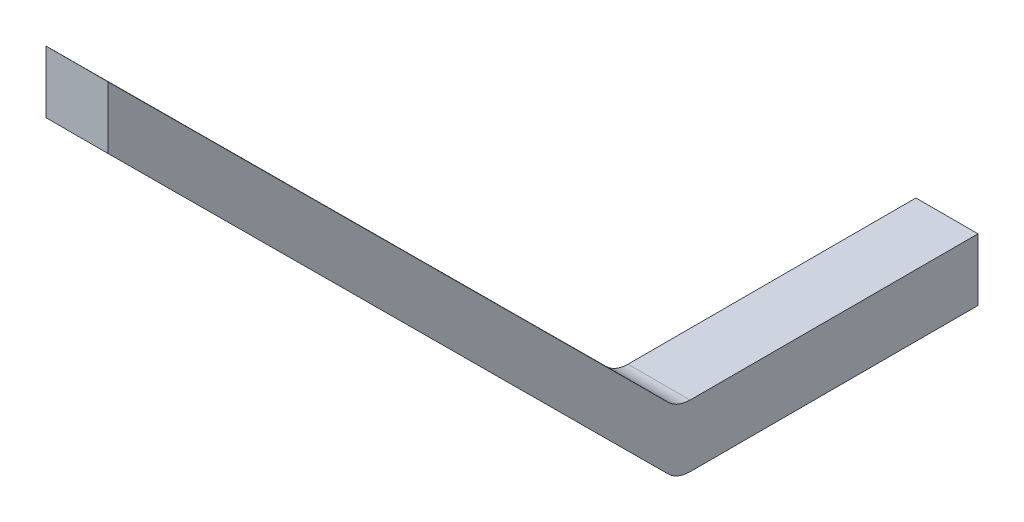
ISO-10303-21;
HEADER;
FILE_DESCRIPTION(('STEP AP214'),'2;1');
FILE_NAME('part.step','',(''),(''),'','','');
FILE_SCHEMA(('AUTOMOTIVE_DESIGN { 1 0 10303 214 1 1 1 1 }'));
ENDSEC;
DATA;
#1=APPLICATION_CONTEXT('core data for automotive mechanical design processes');
#2=APPLICATION_PROTOCOL_DEFINITION('international standard','automotive_design',2000,#1);
#3=PRODUCT_CONTEXT('',#1,'mechanical');
#4=PRODUCT('Part','Part','',(#3));
#5=PRODUCT_RELATED_PRODUCT_CATEGORY('part','',(#4));
#6=PRODUCT_DEFINITION_FORMATION('','',#4);
#7=PRODUCT_DEFINITION_CONTEXT('part definition',#1,'design');
#8=PRODUCT_DEFINITION('design','',#6,#7);
#9=PRODUCT_DEFINITION_SHAPE('','',#8);
#10=(LENGTH_UNIT() NAMED_UNIT(*) SI_UNIT(.MILLI.,.METRE.));
#11=(NAMED_UNIT(*) PLANE_ANGLE_UNIT() SI_UNIT($,.RADIAN.));
#12=(NAMED_UNIT(*) SI_UNIT($,.STERADIAN.) SOLID_ANGLE_UNIT());
#13=UNCERTAINTY_MEASURE_WITH_UNIT(LENGTH_MEASURE(1.E-05),#10,'distance_accuracy_value','');
#14=(GEOMETRIC_REPRESENTATION_CONTEXT(3) GLOBAL_UNCERTAINTY_ASSIGNED_CONTEXT((#13)) GLOBAL_UNIT_ASSIGNED_CONTEXT((#10,
#11,#12)) REPRESENTATION_CONTEXT('',''));
#15=CARTESIAN_POINT('',(0.,0.,0.));
#16=DIRECTION('',(0.,0.,1.));
#17=DIRECTION('',(1.,0.,0.));
#18=AXIS2_PLACEMENT_3D('',#15,#16,#17);
#19=CARTESIAN_POINT('',(6.,0.,0.));
#20=DIRECTION('',(0.,0.,1.));
#21=DIRECTION('',(1.,0.,0.));
#22=AXIS2_PLACEMENT_3D('',#19,#20,#21);
#23=PLANE('',#22);
#24=DIRECTION('',(0.,1.,0.));
#25=VECTOR('',#24,1.);
#26=CARTESIAN_POINT('',(0.,0.,0.));
#27=LINE('',#26,#25);
#28=CARTESIAN_POINT('',(0.,0.,0.));
#29=VERTEX_POINT('',#28);
#30=CARTESIAN_POINT('',(0.,6.,0.));
#31=VERTEX_POINT('',#30);
#32=EDGE_CURVE('E123',#29,#31,#27,.T.);
#33=ORIENTED_EDGE('',*,*,#32,.T.);
#34=DIRECTION('',(-1.,0.,0.));
#35=VECTOR('',#34,1.);
#36=CARTESIAN_POINT('',(6.,6.,0.));
#37=LINE('',#36,#35);
#38=CARTESIAN_POINT('',(6.,6.,0.));
#39=VERTEX_POINT('',#38);
#40=EDGE_CURVE('E104',#39,#31,#37,.T.);
#41=ORIENTED_EDGE('',*,*,#40,.F.);
#42=DIRECTION('',(0.,1.,0.));
#43=VECTOR('',#42,1.);
#44=CARTESIAN_POINT('',(6.,0.,0.));
#45=LINE('',#44,#43);
#46=CARTESIAN_POINT('',(6.,0.,0.));
#47=VERTEX_POINT('',#46);
#48=EDGE_CURVE('E111',#47,#39,#45,.T.);
#49=ORIENTED_EDGE('',*,*,#48,.F.);
#50=DIRECTION('',(-1.,0.,0.));
#51=VECTOR('',#50,1.);
#52=CARTESIAN_POINT('',(6.,0.,0.));
#53=LINE('',#52,#51);
#54=EDGE_CURVE('E162',#47,#29,#53,.T.);
#55=ORIENTED_EDGE('',*,*,#54,.T.);
#56=EDGE_LOOP('',(#33,#41,#49,#55));
#57=FACE_BOUND('',#56,.T.);
#58=ADVANCED_FACE('F33',(#57),#23,.F.);
#59=CARTESIAN_POINT('',(6.,6.,0.));
#60=DIRECTION('',(0.,-1.,0.));
#61=DIRECTION('',(0.,0.,-1.));
#62=AXIS2_PLACEMENT_3D('',#59,#60,#61);
#63=PLANE('',#62);
#64=DIRECTION('',(0.,0.,1.));
#65=VECTOR('',#64,1.);
#66=CARTESIAN_POINT('',(0.,6.,0.));
#67=LINE('',#66,#65);
#68=CARTESIAN_POINT('',(0.,6.,27.8288083854139));
#69=VERTEX_POINT('',#68);
#70=EDGE_CURVE('E143',#31,#69,#67,.T.);
#71=ORIENTED_EDGE('',*,*,#70,.T.);
#72=DIRECTION('',(-1.,0.,0.));
#73=VECTOR('',#72,1.);
#74=CARTESIAN_POINT('',(6.,6.,27.8288083854139));
#75=LINE('',#74,#73);
#76=CARTESIAN_POINT('',(6.,6.,27.8288083854139));
#77=VERTEX_POINT('',#76);
#78=EDGE_CURVE('E107',#69,#77,#75,.F.);
#79=ORIENTED_EDGE('',*,*,#78,.T.);
#80=DIRECTION('',(0.,0.,1.));
#81=VECTOR('',#80,1.);
#82=CARTESIAN_POINT('',(6.,6.,0.));
#83=LINE('',#82,#81);
#84=EDGE_CURVE('E99',#39,#77,#83,.T.);
#85=ORIENTED_EDGE('',*,*,#84,.F.);
#86=ORIENTED_EDGE('',*,*,#40,.T.);
#87=EDGE_LOOP('',(#71,#79,#85,#86));
#88=FACE_BOUND('',#87,.T.);
#89=ADVANCED_FACE('F102',(#88),#63,.F.);
#90=CARTESIAN_POINT('',(6.,6.,29.0674478689844));
#91=DIRECTION('',(0.,-0.708715664077195,0.705494229240481));
#92=DIRECTION('',(0.,-0.705494229240481,-0.708715664077195));
#93=AXIS2_PLACEMENT_3D('',#90,#91,#92);
#94=PLANE('',#93);
#95=DIRECTION('',(0.,0.705494229240481,0.708715664077195));
#96=VECTOR('',#95,1.);
#97=CARTESIAN_POINT('',(6.,6.,29.0674478689844));
#98=LINE('',#97,#96);
#99=CARTESIAN_POINT('',(6.,6.87385300776841,29.9452910731353));
#100=VERTEX_POINT('',#99);
#101=CARTESIAN_POINT('',(6.,60.75,84.0674478689844));
#102=VERTEX_POINT('',#101);
#103=EDGE_CURVE('E110',#100,#102,#98,.T.);
#104=ORIENTED_EDGE('',*,*,#103,.F.);
#105=DIRECTION('',(-1.,0.,0.));
#106=VECTOR('',#105,1.);
#107=CARTESIAN_POINT('',(0.,6.87385300776841,29.9452910731353));
#108=LINE('',#107,#106);
#109=CARTESIAN_POINT('',(0.,6.87385300776841,29.9452910731353));
#110=VERTEX_POINT('',#109);
#111=EDGE_CURVE('E124',#100,#110,#108,.T.);
#112=ORIENTED_EDGE('',*,*,#111,.T.);
#113=DIRECTION('',(0.,0.705494229240481,0.708715664077195));
#114=VECTOR('',#113,1.);
#115=CARTESIAN_POINT('',(0.,6.,29.0674478689844));
#116=LINE('',#115,#114);
#117=CARTESIAN_POINT('',(0.,60.75,84.0674478689844));
#118=VERTEX_POINT('',#117);
#119=EDGE_CURVE('E145',#110,#118,#116,.T.);
#120=ORIENTED_EDGE('',*,*,#119,.T.);
#121=DIRECTION('',(-1.,0.,0.));
#122=VECTOR('',#121,1.);
#123=CARTESIAN_POINT('',(6.,60.75,84.0674478689844));
#124=LINE('',#123,#122);
#125=EDGE_CURVE('E125',#102,#118,#124,.T.);
#126=ORIENTED_EDGE('',*,*,#125,.F.);
#127=EDGE_LOOP('',(#104,#112,#120,#126));
#128=FACE_BOUND('',#127,.T.);
#129=ADVANCED_FACE('F153',(#128),#94,.F.);
#130=CARTESIAN_POINT('',(6.,60.75,84.0674478689844));
#131=DIRECTION('',(0.,0.,-1.));
#132=DIRECTION('',(-1.,0.,0.));
#133=AXIS2_PLACEMENT_3D('',#130,#131,#132);
#134=PLANE('',#133);
#135=DIRECTION('',(0.,-1.,0.));
#136=VECTOR('',#135,1.);
#137=CARTESIAN_POINT('',(0.,60.75,84.0674478689844));
#138=LINE('',#137,#136);
#139=CARTESIAN_POINT('',(0.,54.75,84.0674478689844));
#140=VERTEX_POINT('',#139);
#141=EDGE_CURVE('E165',#118,#140,#138,.T.);
#142=ORIENTED_EDGE('',*,*,#141,.T.);
#143=DIRECTION('',(-1.,0.,0.));
#144=VECTOR('',#143,1.);
#145=CARTESIAN_POINT('',(6.,54.75,84.0674478689844));
#146=LINE('',#145,#144);
#147=CARTESIAN_POINT('',(6.,54.75,84.0674478689844));
#148=VERTEX_POINT('',#147);
#149=EDGE_CURVE('E130',#148,#140,#146,.T.);
#150=ORIENTED_EDGE('',*,*,#149,.F.);
#151=DIRECTION('',(0.,-1.,0.));
#152=VECTOR('',#151,1.);
#153=CARTESIAN_POINT('',(6.,60.75,84.0674478689844));
#154=LINE('',#153,#152);
#155=EDGE_CURVE('E155',#102,#148,#154,.T.);
#156=ORIENTED_EDGE('',*,*,#155,.F.);
#157=ORIENTED_EDGE('',*,*,#125,.T.);
#158=EDGE_LOOP('',(#142,#150,#156,#157));
#159=FACE_BOUND('',#158,.T.);
#160=ADVANCED_FACE('F174',(#159),#134,.F.);
#161=CARTESIAN_POINT('',(6.,54.75,84.0674478689844));
#162=DIRECTION('',(0.,0.708715664077195,-0.705494229240481));
#163=DIRECTION('',(0.,0.705494229240481,0.708715664077195));
#164=AXIS2_PLACEMENT_3D('',#161,#162,#163);
#165=PLANE('',#164);
#166=DIRECTION('',(0.,-0.705494229240481,-0.708715664077195));
#167=VECTOR('',#166,1.);
#168=CARTESIAN_POINT('',(0.,54.75,84.0674478689844));
#169=LINE('',#168,#167);
#170=CARTESIAN_POINT('',(0.,0.873853007768419,29.9452910731353));
#171=VERTEX_POINT('',#170);
#172=EDGE_CURVE('E167',#140,#171,#169,.T.);
#173=ORIENTED_EDGE('',*,*,#172,.T.);
#174=DIRECTION('',(-1.,0.,0.));
#175=VECTOR('',#174,1.);
#176=CARTESIAN_POINT('',(6.,0.873853007768419,29.9452910731353));
#177=LINE('',#176,#175);
#178=CARTESIAN_POINT('',(6.,0.873853007768419,29.9452910731353));
#179=VERTEX_POINT('',#178);
#180=EDGE_CURVE('E48',#171,#179,#177,.F.);
#181=ORIENTED_EDGE('',*,*,#180,.T.);
#182=DIRECTION('',(0.,-0.705494229240481,-0.708715664077195));
#183=VECTOR('',#182,1.);
#184=CARTESIAN_POINT('',(6.,54.75,84.0674478689844));
#185=LINE('',#184,#183);
#186=EDGE_CURVE('E157',#148,#179,#185,.T.);
#187=ORIENTED_EDGE('',*,*,#186,.F.);
#188=ORIENTED_EDGE('',*,*,#149,.T.);
#189=EDGE_LOOP('',(#173,#181,#187,#188));
#190=FACE_BOUND('',#189,.T.);
#191=ADVANCED_FACE('F172',(#190),#165,.F.);
#192=CARTESIAN_POINT('',(6.,0.,0.));
#193=DIRECTION('',(0.,1.,0.));
#194=DIRECTION('',(0.,0.,1.));
#195=AXIS2_PLACEMENT_3D('',#192,#193,#194);
#196=PLANE('',#195);
#197=DIRECTION('',(0.,0.,-1.));
#198=VECTOR('',#197,1.);
#199=CARTESIAN_POINT('',(6.,0.,0.));
#200=LINE('',#199,#198);
#201=CARTESIAN_POINT('',(6.,0.,27.8288083854139));
#202=VERTEX_POINT('',#201);
#203=EDGE_CURVE('E116',#202,#47,#200,.T.);
#204=ORIENTED_EDGE('',*,*,#203,.F.);
#205=DIRECTION('',(-1.,0.,0.));
#206=VECTOR('',#205,1.);
#207=CARTESIAN_POINT('',(6.,0.,27.8288083854139));
#208=LINE('',#207,#206);
#209=CARTESIAN_POINT('',(0.,0.,27.8288083854139));
#210=VERTEX_POINT('',#209);
#211=EDGE_CURVE('E135',#202,#210,#208,.T.);
#212=ORIENTED_EDGE('',*,*,#211,.T.);
#213=DIRECTION('',(0.,0.,-1.));
#214=VECTOR('',#213,1.);
#215=CARTESIAN_POINT('',(0.,0.,0.));
#216=LINE('',#215,#214);
#217=EDGE_CURVE('E120',#210,#29,#216,.T.);
#218=ORIENTED_EDGE('',*,*,#217,.T.);
#219=ORIENTED_EDGE('',*,*,#54,.F.);
#220=EDGE_LOOP('',(#204,#212,#218,#219));
#221=FACE_BOUND('',#220,.T.);
#222=ADVANCED_FACE('F179',(#221),#196,.F.);
#223=CARTESIAN_POINT('',(6.,0.,0.));
#224=DIRECTION('',(1.,0.,0.));
#225=DIRECTION('',(0.,0.,-1.));
#226=AXIS2_PLACEMENT_3D('',#223,#224,#225);
#227=PLANE('',#226);
#228=ORIENTED_EDGE('',*,*,#186,.T.);
#229=CARTESIAN_POINT('',(6.,3.,27.8288083854139));
#230=DIRECTION('',(1.,0.,0.));
#231=DIRECTION('',(0.,0.,-1.));
#232=AXIS2_PLACEMENT_3D('',#229,#230,#231);
#233=CIRCLE('',#232,3.);
#234=EDGE_CURVE('E140',#179,#202,#233,.T.);
#235=ORIENTED_EDGE('',*,*,#234,.T.);
#236=ORIENTED_EDGE('',*,*,#203,.T.);
#237=ORIENTED_EDGE('',*,*,#48,.T.);
#238=ORIENTED_EDGE('',*,*,#84,.T.);
#239=CARTESIAN_POINT('',(6.,9.,27.8288083854139));
#240=DIRECTION('',(1.,0.,0.));
#241=DIRECTION('',(0.,0.,-1.));
#242=AXIS2_PLACEMENT_3D('',#239,#240,#241);
#243=CIRCLE('',#242,3.);
#244=EDGE_CURVE('E11',#77,#100,#243,.F.);
#245=ORIENTED_EDGE('',*,*,#244,.T.);
#246=ORIENTED_EDGE('',*,*,#103,.T.);
#247=ORIENTED_EDGE('',*,*,#155,.T.);
#248=EDGE_LOOP('',(#228,#235,#236,#237,#238,#245,#246,#247));
#249=FACE_BOUND('',#248,.T.);
#250=ADVANCED_FACE('F114',(#249),#227,.T.);
#251=CARTESIAN_POINT('',(0.,0.,0.));
#252=DIRECTION('',(1.,0.,0.));
#253=DIRECTION('',(0.,0.,-1.));
#254=AXIS2_PLACEMENT_3D('',#251,#252,#253);
#255=PLANE('',#254);
#256=ORIENTED_EDGE('',*,*,#217,.F.);
#257=CARTESIAN_POINT('',(0.,3.,27.8288083854139));
#258=DIRECTION('',(1.,0.,0.));
#259=DIRECTION('',(0.,0.,-1.));
#260=AXIS2_PLACEMENT_3D('',#257,#258,#259);
#261=CIRCLE('',#260,3.);
#262=EDGE_CURVE('E56',#210,#171,#261,.F.);
#263=ORIENTED_EDGE('',*,*,#262,.T.);
#264=ORIENTED_EDGE('',*,*,#172,.F.);
#265=ORIENTED_EDGE('',*,*,#141,.F.);
#266=ORIENTED_EDGE('',*,*,#119,.F.);
#267=CARTESIAN_POINT('',(0.,9.,27.8288083854139));
#268=DIRECTION('',(1.,0.,0.));
#269=DIRECTION('',(0.,0.,-1.));
#270=AXIS2_PLACEMENT_3D('',#267,#268,#269);
#271=CIRCLE('',#270,3.);
#272=EDGE_CURVE('E41',#110,#69,#271,.T.);
#273=ORIENTED_EDGE('',*,*,#272,.T.);
#274=ORIENTED_EDGE('',*,*,#70,.F.);
#275=ORIENTED_EDGE('',*,*,#32,.F.);
#276=EDGE_LOOP('',(#256,#263,#264,#265,#266,#273,#274,#275));
#277=FACE_BOUND('',#276,.T.);
#278=ADVANCED_FACE('F142',(#277),#255,.F.);
#279=CARTESIAN_POINT('',(6.,9.,27.8288083854139));
#280=DIRECTION('',(1.,0.,0.));
#281=DIRECTION('',(0.,0.,-1.));
#282=AXIS2_PLACEMENT_3D('',#279,#280,#281);
#283=CYLINDRICAL_SURFACE('',#282,3.);
#284=ORIENTED_EDGE('',*,*,#244,.F.);
#285=ORIENTED_EDGE('',*,*,#78,.F.);
#286=ORIENTED_EDGE('',*,*,#272,.F.);
#287=ORIENTED_EDGE('',*,*,#111,.F.);
#288=EDGE_LOOP('',(#284,#285,#286,#287));
#289=FACE_BOUND('',#288,.T.);
#290=ADVANCED_FACE('F149',(#289),#283,.F.);
#291=CARTESIAN_POINT('',(6.,3.,27.8288083854139));
#292=DIRECTION('',(-1.,0.,0.));
#293=DIRECTION('',(0.,0.,1.));
#294=AXIS2_PLACEMENT_3D('',#291,#292,#293);
#295=CYLINDRICAL_SURFACE('',#294,3.);
#296=ORIENTED_EDGE('',*,*,#234,.F.);
#297=ORIENTED_EDGE('',*,*,#180,.F.);
#298=ORIENTED_EDGE('',*,*,#262,.F.);
#299=ORIENTED_EDGE('',*,*,#211,.F.);
#300=EDGE_LOOP('',(#296,#297,#298,#299));
#301=FACE_BOUND('',#300,.T.);
#302=ADVANCED_FACE('F35',(#301),#295,.T.);
#303=CLOSED_SHELL('',(#58,#89,#129,#160,#191,#222,#250,#278,#290,#302));
#304=MANIFOLD_SOLID_BREP('B2',#303);
#305=ADVANCED_BREP_SHAPE_REPRESENTATION('',(#18,#304),#14);
#306=SHAPE_DEFINITION_REPRESENTATION(#9,#305);
ENDSEC;
END-ISO-10303-21;
